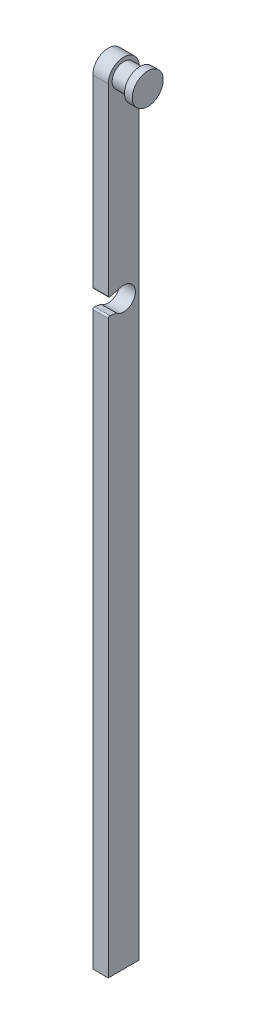
ISO-10303-21;
HEADER;
FILE_DESCRIPTION(('STEP AP214'),'2;1');
FILE_NAME('part.step','',(''),(''),'','','');
FILE_SCHEMA(('AUTOMOTIVE_DESIGN { 1 0 10303 214 1 1 1 1 }'));
ENDSEC;
DATA;
#1=APPLICATION_CONTEXT('core data for automotive mechanical design processes');
#2=APPLICATION_PROTOCOL_DEFINITION('international standard','automotive_design',2000,#1);
#3=PRODUCT_CONTEXT('',#1,'mechanical');
#4=PRODUCT('Part','Part','',(#3));
#5=PRODUCT_RELATED_PRODUCT_CATEGORY('part','',(#4));
#6=PRODUCT_DEFINITION_FORMATION('','',#4);
#7=PRODUCT_DEFINITION_CONTEXT('part definition',#1,'design');
#8=PRODUCT_DEFINITION('design','',#6,#7);
#9=PRODUCT_DEFINITION_SHAPE('','',#8);
#10=(LENGTH_UNIT() NAMED_UNIT(*) SI_UNIT(.MILLI.,.METRE.));
#11=(NAMED_UNIT(*) PLANE_ANGLE_UNIT() SI_UNIT($,.RADIAN.));
#12=(NAMED_UNIT(*) SI_UNIT($,.STERADIAN.) SOLID_ANGLE_UNIT());
#13=UNCERTAINTY_MEASURE_WITH_UNIT(LENGTH_MEASURE(1.E-05),#10,'distance_accuracy_value','');
#14=(GEOMETRIC_REPRESENTATION_CONTEXT(3) GLOBAL_UNCERTAINTY_ASSIGNED_CONTEXT((#13)) GLOBAL_UNIT_ASSIGNED_CONTEXT((#10,
#11,#12)) REPRESENTATION_CONTEXT('',''));
#15=CARTESIAN_POINT('',(0.,0.,0.));
#16=DIRECTION('',(0.,0.,1.));
#17=DIRECTION('',(1.,0.,0.));
#18=AXIS2_PLACEMENT_3D('',#15,#16,#17);
#19=CARTESIAN_POINT('',(2.,50.,2.00000000000001));
#20=DIRECTION('',(0.,0.,-1.));
#21=DIRECTION('',(0.,1.,0.));
#22=AXIS2_PLACEMENT_3D('',#19,#20,#21);
#23=PLANE('',#22);
#24=DIRECTION('',(0.,-1.,0.));
#25=VECTOR('',#24,1.);
#26=CARTESIAN_POINT('',(2.,50.,2.00000000000001));
#27=LINE('',#26,#25);
#28=CARTESIAN_POINT('',(2.,23.7651880496262,2.));
#29=VERTEX_POINT('',#28);
#30=CARTESIAN_POINT('',(2.,-50.,1.99999999999999));
#31=VERTEX_POINT('',#30);
#32=EDGE_CURVE('E156',#29,#31,#27,.T.);
#33=ORIENTED_EDGE('',*,*,#32,.F.);
#34=DIRECTION('',(-1.,0.,0.));
#35=VECTOR('',#34,1.);
#36=CARTESIAN_POINT('',(2.,23.7651880496262,2.));
#37=LINE('',#36,#35);
#38=CARTESIAN_POINT('',(0.,23.7651880496262,2.));
#39=VERTEX_POINT('',#38);
#40=EDGE_CURVE('E41',#29,#39,#37,.T.);
#41=ORIENTED_EDGE('',*,*,#40,.T.);
#42=DIRECTION('',(0.,-1.,0.));
#43=VECTOR('',#42,1.);
#44=CARTESIAN_POINT('',(0.,50.,2.00000000000001));
#45=LINE('',#44,#43);
#46=CARTESIAN_POINT('',(0.,-50.,1.99999999999999));
#47=VERTEX_POINT('',#46);
#48=EDGE_CURVE('E149',#39,#47,#45,.T.);
#49=ORIENTED_EDGE('',*,*,#48,.T.);
#50=DIRECTION('',(-1.,0.,0.));
#51=VECTOR('',#50,1.);
#52=CARTESIAN_POINT('',(2.,-50.,1.99999999999999));
#53=LINE('',#52,#51);
#54=EDGE_CURVE('E180',#31,#47,#53,.T.);
#55=ORIENTED_EDGE('',*,*,#54,.F.);
#56=EDGE_LOOP('',(#33,#41,#49,#55));
#57=FACE_BOUND('',#56,.T.);
#58=ADVANCED_FACE('F33',(#57),#23,.F.);
#59=CARTESIAN_POINT('',(2.,50.,0.));
#60=DIRECTION('',(1.,0.,0.));
#61=DIRECTION('',(0.,0.,-1.));
#62=AXIS2_PLACEMENT_3D('',#59,#60,#61);
#63=PLANE('',#62);
#64=CARTESIAN_POINT('',(2.,50.,2.00000000000001));
#65=VERTEX_POINT('',#64);
#66=CARTESIAN_POINT('',(2.,26.2617020069513,2.));
#67=VERTEX_POINT('',#66);
#68=EDGE_CURVE('E152',#65,#67,#27,.T.);
#69=ORIENTED_EDGE('',*,*,#68,.T.);
#70=CARTESIAN_POINT('',(2.,26.2617020069512,1.8));
#71=DIRECTION('',(1.,0.,0.));
#72=DIRECTION('',(0.,0.,-1.));
#73=AXIS2_PLACEMENT_3D('',#70,#71,#72);
#74=CIRCLE('',#73,0.2);
#75=CARTESIAN_POINT('',(2.,26.0687205523237,1.74748183009805));
#76=VERTEX_POINT('',#75);
#77=EDGE_CURVE('E192',#67,#76,#74,.T.);
#78=ORIENTED_EDGE('',*,*,#77,.T.);
#79=DIRECTION('',(0.,0.262590849509768,-0.964907273137548));
#80=VECTOR('',#79,1.);
#81=CARTESIAN_POINT('',(2.,26.4830021162811,0.225177092763945));
#82=LINE('',#81,#80);
#83=CARTESIAN_POINT('',(2.,26.4830021162811,0.225177092763945));
#84=VERTEX_POINT('',#83);
#85=EDGE_CURVE('E136',#76,#84,#82,.T.);
#86=ORIENTED_EDGE('',*,*,#85,.T.);
#87=CARTESIAN_POINT('',(2.,25.,0.));
#88=DIRECTION('',(1.,0.,0.));
#89=DIRECTION('',(0.,0.,-1.));
#90=AXIS2_PLACEMENT_3D('',#87,#88,#89);
#91=CIRCLE('',#90,1.5);
#92=CARTESIAN_POINT('',(2.,23.8286967858354,0.937042571331634));
#93=VERTEX_POINT('',#92);
#94=EDGE_CURVE('E117',#84,#93,#91,.F.);
#95=ORIENTED_EDGE('',*,*,#94,.T.);
#96=DIRECTION('',(0.,0.159104316938012,0.987261777003287));
#97=VECTOR('',#96,1.);
#98=CARTESIAN_POINT('',(2.,24.,2.00000000000001));
#99=LINE('',#98,#97);
#100=CARTESIAN_POINT('',(2.,23.9626404050269,1.7681791366124));
#101=VERTEX_POINT('',#100);
#102=EDGE_CURVE('E112',#93,#101,#99,.T.);
#103=ORIENTED_EDGE('',*,*,#102,.T.);
#104=CARTESIAN_POINT('',(2.,23.7651880496262,1.8));
#105=DIRECTION('',(1.,0.,0.));
#106=DIRECTION('',(0.,0.,-1.));
#107=AXIS2_PLACEMENT_3D('',#104,#105,#106);
#108=CIRCLE('',#107,0.2);
#109=EDGE_CURVE('E48',#101,#29,#108,.T.);
#110=ORIENTED_EDGE('',*,*,#109,.T.);
#111=ORIENTED_EDGE('',*,*,#32,.T.);
#112=DIRECTION('',(0.,0.,-1.));
#113=VECTOR('',#112,1.);
#114=CARTESIAN_POINT('',(2.,-50.,-2.00000000000001));
#115=LINE('',#114,#113);
#116=CARTESIAN_POINT('',(2.,-50.,-2.00000000000001));
#117=VERTEX_POINT('',#116);
#118=EDGE_CURVE('E155',#31,#117,#115,.T.);
#119=ORIENTED_EDGE('',*,*,#118,.T.);
#120=DIRECTION('',(0.,1.,0.));
#121=VECTOR('',#120,1.);
#122=CARTESIAN_POINT('',(2.,50.,-1.99999999999999));
#123=LINE('',#122,#121);
#124=CARTESIAN_POINT('',(2.,50.,-1.99999999999999));
#125=VERTEX_POINT('',#124);
#126=EDGE_CURVE('E158',#117,#125,#123,.T.);
#127=ORIENTED_EDGE('',*,*,#126,.T.);
#128=CARTESIAN_POINT('',(2.,50.,0.));
#129=DIRECTION('',(1.,0.,0.));
#130=DIRECTION('',(0.,0.,-1.));
#131=AXIS2_PLACEMENT_3D('',#128,#129,#130);
#132=CIRCLE('',#131,2.);
#133=EDGE_CURVE('E160',#125,#65,#132,.T.);
#134=ORIENTED_EDGE('',*,*,#133,.T.);
#135=EDGE_LOOP('',(#69,#78,#86,#95,#103,#110,#111,#119,#127,#134));
#136=FACE_BOUND('',#135,.T.);
#137=CARTESIAN_POINT('',(2.,50.,0.));
#138=DIRECTION('',(1.,0.,0.));
#139=DIRECTION('',(0.,0.,-1.));
#140=AXIS2_PLACEMENT_3D('',#137,#138,#139);
#141=CIRCLE('',#140,1.5);
#142=CARTESIAN_POINT('',(2.,50.,-1.5));
#143=VERTEX_POINT('',#142);
#144=EDGE_CURVE('E143',#143,#143,#141,.T.);
#145=ORIENTED_EDGE('',*,*,#144,.F.);
#146=EDGE_LOOP('',(#145));
#147=FACE_BOUND('',#146,.T.);
#148=ADVANCED_FACE('F206',(#136,#147),#63,.T.);
#149=CARTESIAN_POINT('',(0.,50.,2.00000000000001));
#150=VERTEX_POINT('',#149);
#151=CARTESIAN_POINT('',(0.,26.2617020069513,2.));
#152=VERTEX_POINT('',#151);
#153=EDGE_CURVE('E163',#150,#152,#45,.T.);
#154=ORIENTED_EDGE('',*,*,#153,.T.);
#155=DIRECTION('',(-1.,0.,0.));
#156=VECTOR('',#155,1.);
#157=CARTESIAN_POINT('',(2.,26.2617020069512,2.));
#158=LINE('',#157,#156);
#159=EDGE_CURVE('E189',#152,#67,#158,.F.);
#160=ORIENTED_EDGE('',*,*,#159,.T.);
#161=ORIENTED_EDGE('',*,*,#68,.F.);
#162=DIRECTION('',(-1.,0.,0.));
#163=VECTOR('',#162,1.);
#164=CARTESIAN_POINT('',(2.,50.,2.00000000000001));
#165=LINE('',#164,#163);
#166=EDGE_CURVE('E162',#65,#150,#165,.T.);
#167=ORIENTED_EDGE('',*,*,#166,.T.);
#168=EDGE_LOOP('',(#154,#160,#161,#167));
#169=FACE_BOUND('',#168,.T.);
#170=ADVANCED_FACE('F218',(#169),#23,.F.);
#171=CARTESIAN_POINT('',(2.,-50.,-2.00000000000001));
#172=DIRECTION('',(0.,1.,0.));
#173=DIRECTION('',(0.,0.,1.));
#174=AXIS2_PLACEMENT_3D('',#171,#172,#173);
#175=PLANE('',#174);
#176=DIRECTION('',(0.,0.,-1.));
#177=VECTOR('',#176,1.);
#178=CARTESIAN_POINT('',(0.,-50.,-2.00000000000001));
#179=LINE('',#178,#177);
#180=CARTESIAN_POINT('',(0.,-50.,-2.00000000000001));
#181=VERTEX_POINT('',#180);
#182=EDGE_CURVE('E166',#47,#181,#179,.T.);
#183=ORIENTED_EDGE('',*,*,#182,.T.);
#184=DIRECTION('',(-1.,0.,0.));
#185=VECTOR('',#184,1.);
#186=CARTESIAN_POINT('',(2.,-50.,-2.00000000000001));
#187=LINE('',#186,#185);
#188=EDGE_CURVE('E177',#117,#181,#187,.T.);
#189=ORIENTED_EDGE('',*,*,#188,.F.);
#190=ORIENTED_EDGE('',*,*,#118,.F.);
#191=ORIENTED_EDGE('',*,*,#54,.T.);
#192=EDGE_LOOP('',(#183,#189,#190,#191));
#193=FACE_BOUND('',#192,.T.);
#194=ADVANCED_FACE('F204',(#193),#175,.F.);
#195=CARTESIAN_POINT('',(2.,50.,-1.99999999999999));
#196=DIRECTION('',(0.,0.,1.));
#197=DIRECTION('',(0.,-1.,0.));
#198=AXIS2_PLACEMENT_3D('',#195,#196,#197);
#199=PLANE('',#198);
#200=DIRECTION('',(0.,1.,0.));
#201=VECTOR('',#200,1.);
#202=CARTESIAN_POINT('',(0.,50.,-1.99999999999999));
#203=LINE('',#202,#201);
#204=CARTESIAN_POINT('',(0.,50.,-1.99999999999999));
#205=VERTEX_POINT('',#204);
#206=EDGE_CURVE('E168',#181,#205,#203,.T.);
#207=ORIENTED_EDGE('',*,*,#206,.T.);
#208=DIRECTION('',(-1.,0.,0.));
#209=VECTOR('',#208,1.);
#210=CARTESIAN_POINT('',(2.,50.,-1.99999999999999));
#211=LINE('',#210,#209);
#212=EDGE_CURVE('E174',#125,#205,#211,.T.);
#213=ORIENTED_EDGE('',*,*,#212,.F.);
#214=ORIENTED_EDGE('',*,*,#126,.F.);
#215=ORIENTED_EDGE('',*,*,#188,.T.);
#216=EDGE_LOOP('',(#207,#213,#214,#215));
#217=FACE_BOUND('',#216,.T.);
#218=ADVANCED_FACE('F212',(#217),#199,.F.);
#219=CARTESIAN_POINT('',(2.,50.,0.));
#220=DIRECTION('',(-1.,0.,0.));
#221=DIRECTION('',(0.,0.,1.));
#222=AXIS2_PLACEMENT_3D('',#219,#220,#221);
#223=CYLINDRICAL_SURFACE('',#222,2.);
#224=CARTESIAN_POINT('',(0.,50.,0.));
#225=DIRECTION('',(1.,0.,0.));
#226=DIRECTION('',(0.,0.,-1.));
#227=AXIS2_PLACEMENT_3D('',#224,#225,#226);
#228=CIRCLE('',#227,2.);
#229=EDGE_CURVE('E170',#205,#150,#228,.T.);
#230=ORIENTED_EDGE('',*,*,#229,.T.);
#231=ORIENTED_EDGE('',*,*,#166,.F.);
#232=ORIENTED_EDGE('',*,*,#133,.F.);
#233=ORIENTED_EDGE('',*,*,#212,.T.);
#234=EDGE_LOOP('',(#230,#231,#232,#233));
#235=FACE_BOUND('',#234,.T.);
#236=ADVANCED_FACE('F214',(#235),#223,.T.);
#237=CARTESIAN_POINT('',(0.,50.,0.));
#238=DIRECTION('',(1.,0.,0.));
#239=DIRECTION('',(0.,0.,-1.));
#240=AXIS2_PLACEMENT_3D('',#237,#238,#239);
#241=PLANE('',#240);
#242=DIRECTION('',(0.,0.262590849509768,-0.964907273137548));
#243=VECTOR('',#242,1.);
#244=CARTESIAN_POINT('',(0.,26.4830021162811,0.225177092763945));
#245=LINE('',#244,#243);
#246=CARTESIAN_POINT('',(0.,26.0687205523237,1.74748183009805));
#247=VERTEX_POINT('',#246);
#248=CARTESIAN_POINT('',(0.,26.4830021162811,0.225177092763945));
#249=VERTEX_POINT('',#248);
#250=EDGE_CURVE('E131',#247,#249,#245,.T.);
#251=ORIENTED_EDGE('',*,*,#250,.F.);
#252=CARTESIAN_POINT('',(0.,26.2617020069512,1.8));
#253=DIRECTION('',(1.,0.,0.));
#254=DIRECTION('',(0.,0.,-1.));
#255=AXIS2_PLACEMENT_3D('',#252,#253,#254);
#256=CIRCLE('',#255,0.2);
#257=EDGE_CURVE('E187',#247,#152,#256,.F.);
#258=ORIENTED_EDGE('',*,*,#257,.T.);
#259=ORIENTED_EDGE('',*,*,#153,.F.);
#260=ORIENTED_EDGE('',*,*,#229,.F.);
#261=ORIENTED_EDGE('',*,*,#206,.F.);
#262=ORIENTED_EDGE('',*,*,#182,.F.);
#263=ORIENTED_EDGE('',*,*,#48,.F.);
#264=CARTESIAN_POINT('',(0.,23.7651880496262,1.8));
#265=DIRECTION('',(1.,0.,0.));
#266=DIRECTION('',(0.,0.,-1.));
#267=AXIS2_PLACEMENT_3D('',#264,#265,#266);
#268=CIRCLE('',#267,0.2);
#269=CARTESIAN_POINT('',(0.,23.9626404050269,1.7681791366124));
#270=VERTEX_POINT('',#269);
#271=EDGE_CURVE('E130',#39,#270,#268,.F.);
#272=ORIENTED_EDGE('',*,*,#271,.T.);
#273=DIRECTION('',(0.,0.159104316938012,0.987261777003287));
#274=VECTOR('',#273,1.);
#275=CARTESIAN_POINT('',(0.,24.,2.00000000000001));
#276=LINE('',#275,#274);
#277=CARTESIAN_POINT('',(0.,23.8286967858354,0.937042571331634));
#278=VERTEX_POINT('',#277);
#279=EDGE_CURVE('E111',#278,#270,#276,.T.);
#280=ORIENTED_EDGE('',*,*,#279,.F.);
#281=CARTESIAN_POINT('',(0.,25.,0.));
#282=DIRECTION('',(-1.,0.,0.));
#283=DIRECTION('',(0.,0.,1.));
#284=AXIS2_PLACEMENT_3D('',#281,#282,#283);
#285=CIRCLE('',#284,1.5);
#286=EDGE_CURVE('E121',#249,#278,#285,.T.);
#287=ORIENTED_EDGE('',*,*,#286,.F.);
#288=EDGE_LOOP('',(#251,#258,#259,#260,#261,#262,#263,#272,#280,#287));
#289=FACE_BOUND('',#288,.T.);
#290=ADVANCED_FACE('F128',(#289),#241,.F.);
#291=CARTESIAN_POINT('',(4.1,50.,0.));
#292=DIRECTION('',(-1.,0.,0.));
#293=DIRECTION('',(0.,0.,1.));
#294=AXIS2_PLACEMENT_3D('',#291,#292,#293);
#295=CYLINDRICAL_SURFACE('',#294,1.5);
#296=CARTESIAN_POINT('',(4.1,50.,0.));
#297=DIRECTION('',(1.,0.,0.));
#298=DIRECTION('',(0.,0.,-1.));
#299=AXIS2_PLACEMENT_3D('',#296,#297,#298);
#300=CIRCLE('',#299,1.5);
#301=CARTESIAN_POINT('',(4.1,50.,-1.5));
#302=VERTEX_POINT('',#301);
#303=EDGE_CURVE('E146',#302,#302,#300,.T.);
#304=ORIENTED_EDGE('',*,*,#303,.F.);
#305=EDGE_LOOP('',(#304));
#306=FACE_BOUND('',#305,.T.);
#307=ORIENTED_EDGE('',*,*,#144,.T.);
#308=EDGE_LOOP('',(#307));
#309=FACE_BOUND('',#308,.T.);
#310=ADVANCED_FACE('F250',(#306,#309),#295,.T.);
#311=CARTESIAN_POINT('',(4.1,50.,0.));
#312=DIRECTION('',(1.,0.,0.));
#313=DIRECTION('',(0.,0.,-1.));
#314=AXIS2_PLACEMENT_3D('',#311,#312,#313);
#315=PLANE('',#314);
#316=CARTESIAN_POINT('',(4.1,50.,0.));
#317=DIRECTION('',(1.,0.,0.));
#318=DIRECTION('',(0.,0.,-1.));
#319=AXIS2_PLACEMENT_3D('',#316,#317,#318);
#320=CIRCLE('',#319,2.);
#321=CARTESIAN_POINT('',(4.1,50.,-2.));
#322=VERTEX_POINT('',#321);
#323=EDGE_CURVE('E116',#322,#322,#320,.T.);
#324=ORIENTED_EDGE('',*,*,#323,.F.);
#325=EDGE_LOOP('',(#324));
#326=FACE_BOUND('',#325,.T.);
#327=ORIENTED_EDGE('',*,*,#303,.T.);
#328=EDGE_LOOP('',(#327));
#329=FACE_BOUND('',#328,.T.);
#330=ADVANCED_FACE('F254',(#326,#329),#315,.F.);
#331=CARTESIAN_POINT('',(5.1,50.,0.));
#332=DIRECTION('',(-1.,0.,0.));
#333=DIRECTION('',(0.,0.,1.));
#334=AXIS2_PLACEMENT_3D('',#331,#332,#333);
#335=CYLINDRICAL_SURFACE('',#334,2.);
#336=CARTESIAN_POINT('',(5.1,50.,0.));
#337=DIRECTION('',(1.,0.,0.));
#338=DIRECTION('',(0.,0.,-1.));
#339=AXIS2_PLACEMENT_3D('',#336,#337,#338);
#340=CIRCLE('',#339,2.);
#341=CARTESIAN_POINT('',(5.1,50.,-2.));
#342=VERTEX_POINT('',#341);
#343=EDGE_CURVE('E140',#342,#342,#340,.T.);
#344=ORIENTED_EDGE('',*,*,#343,.F.);
#345=EDGE_LOOP('',(#344));
#346=FACE_BOUND('',#345,.T.);
#347=ORIENTED_EDGE('',*,*,#323,.T.);
#348=EDGE_LOOP('',(#347));
#349=FACE_BOUND('',#348,.T.);
#350=ADVANCED_FACE('F256',(#346,#349),#335,.T.);
#351=CARTESIAN_POINT('',(5.1,50.,0.));
#352=DIRECTION('',(1.,0.,0.));
#353=DIRECTION('',(0.,0.,-1.));
#354=AXIS2_PLACEMENT_3D('',#351,#352,#353);
#355=PLANE('',#354);
#356=ORIENTED_EDGE('',*,*,#343,.T.);
#357=EDGE_LOOP('',(#356));
#358=FACE_BOUND('',#357,.T.);
#359=ADVANCED_FACE('F259',(#358),#355,.T.);
#360=CARTESIAN_POINT('',(6.60977222864645,24.,2.00000000000001));
#361=DIRECTION('',(0.,-0.987261777003287,0.159104316938012));
#362=DIRECTION('',(0.,-0.159104316938012,-0.987261777003287));
#363=AXIS2_PLACEMENT_3D('',#360,#361,#362);
#364=PLANE('',#363);
#365=ORIENTED_EDGE('',*,*,#279,.T.);
#366=DIRECTION('',(-1.,0.,0.));
#367=VECTOR('',#366,1.);
#368=CARTESIAN_POINT('',(6.60977222864645,23.9626404050269,1.7681791366124));
#369=LINE('',#368,#367);
#370=EDGE_CURVE('E11',#270,#101,#369,.F.);
#371=ORIENTED_EDGE('',*,*,#370,.T.);
#372=ORIENTED_EDGE('',*,*,#102,.F.);
#373=DIRECTION('',(-1.,0.,0.));
#374=VECTOR('',#373,1.);
#375=CARTESIAN_POINT('',(6.60977222864645,23.8286967858354,0.937042571331634));
#376=LINE('',#375,#374);
#377=EDGE_CURVE('E107',#93,#278,#376,.T.);
#378=ORIENTED_EDGE('',*,*,#377,.T.);
#379=EDGE_LOOP('',(#365,#371,#372,#378));
#380=FACE_BOUND('',#379,.T.);
#381=ADVANCED_FACE('F109',(#380),#364,.F.);
#382=CARTESIAN_POINT('',(6.60977222864645,26.4830021162811,0.225177092763945));
#383=DIRECTION('',(0.,0.964907273137548,0.262590849509768));
#384=DIRECTION('',(0.,-0.262590849509768,0.964907273137548));
#385=AXIS2_PLACEMENT_3D('',#382,#383,#384);
#386=PLANE('',#385);
#387=ORIENTED_EDGE('',*,*,#85,.F.);
#388=DIRECTION('',(-1.,0.,0.));
#389=VECTOR('',#388,1.);
#390=CARTESIAN_POINT('',(6.60977222864645,26.0687205523237,1.74748183009805));
#391=LINE('',#390,#389);
#392=EDGE_CURVE('E183',#76,#247,#391,.T.);
#393=ORIENTED_EDGE('',*,*,#392,.T.);
#394=ORIENTED_EDGE('',*,*,#250,.T.);
#395=DIRECTION('',(-1.,0.,0.));
#396=VECTOR('',#395,1.);
#397=CARTESIAN_POINT('',(6.60977222864645,26.4830021162811,0.225177092763945));
#398=LINE('',#397,#396);
#399=EDGE_CURVE('E124',#84,#249,#398,.T.);
#400=ORIENTED_EDGE('',*,*,#399,.F.);
#401=EDGE_LOOP('',(#387,#393,#394,#400));
#402=FACE_BOUND('',#401,.T.);
#403=ADVANCED_FACE('F226',(#402),#386,.F.);
#404=CARTESIAN_POINT('',(6.60977222864645,25.,0.));
#405=DIRECTION('',(-1.,0.,0.));
#406=DIRECTION('',(0.,0.,1.));
#407=AXIS2_PLACEMENT_3D('',#404,#405,#406);
#408=CYLINDRICAL_SURFACE('',#407,1.5);
#409=ORIENTED_EDGE('',*,*,#399,.T.);
#410=ORIENTED_EDGE('',*,*,#286,.T.);
#411=ORIENTED_EDGE('',*,*,#377,.F.);
#412=ORIENTED_EDGE('',*,*,#94,.F.);
#413=EDGE_LOOP('',(#409,#410,#411,#412));
#414=FACE_BOUND('',#413,.T.);
#415=ADVANCED_FACE('F122',(#414),#408,.F.);
#416=CARTESIAN_POINT('',(6.60977222864645,26.2617020069512,1.8));
#417=DIRECTION('',(-1.,0.,0.));
#418=DIRECTION('',(0.,0.,1.));
#419=AXIS2_PLACEMENT_3D('',#416,#417,#418);
#420=CYLINDRICAL_SURFACE('',#419,0.2);
#421=ORIENTED_EDGE('',*,*,#77,.F.);
#422=ORIENTED_EDGE('',*,*,#159,.F.);
#423=ORIENTED_EDGE('',*,*,#257,.F.);
#424=ORIENTED_EDGE('',*,*,#392,.F.);
#425=EDGE_LOOP('',(#421,#422,#423,#424));
#426=FACE_BOUND('',#425,.T.);
#427=ADVANCED_FACE('F224',(#426),#420,.T.);
#428=CARTESIAN_POINT('',(2.,23.7651880496262,1.8));
#429=DIRECTION('',(-1.,0.,0.));
#430=DIRECTION('',(0.,0.,1.));
#431=AXIS2_PLACEMENT_3D('',#428,#429,#430);
#432=CYLINDRICAL_SURFACE('',#431,0.2);
#433=ORIENTED_EDGE('',*,*,#109,.F.);
#434=ORIENTED_EDGE('',*,*,#370,.F.);
#435=ORIENTED_EDGE('',*,*,#271,.F.);
#436=ORIENTED_EDGE('',*,*,#40,.F.);
#437=EDGE_LOOP('',(#433,#434,#435,#436));
#438=FACE_BOUND('',#437,.T.);
#439=ADVANCED_FACE('F35',(#438),#432,.T.);
#440=CLOSED_SHELL('',(#58,#148,#170,#194,#218,#236,#290,#310,#330,#350,#359,#381,#403,#415,#427,#439));
#441=MANIFOLD_SOLID_BREP('B2',#440);
#442=ADVANCED_BREP_SHAPE_REPRESENTATION('',(#18,#441),#14);
#443=SHAPE_DEFINITION_REPRESENTATION(#9,#442);
ENDSEC;
END-ISO-10303-21;
